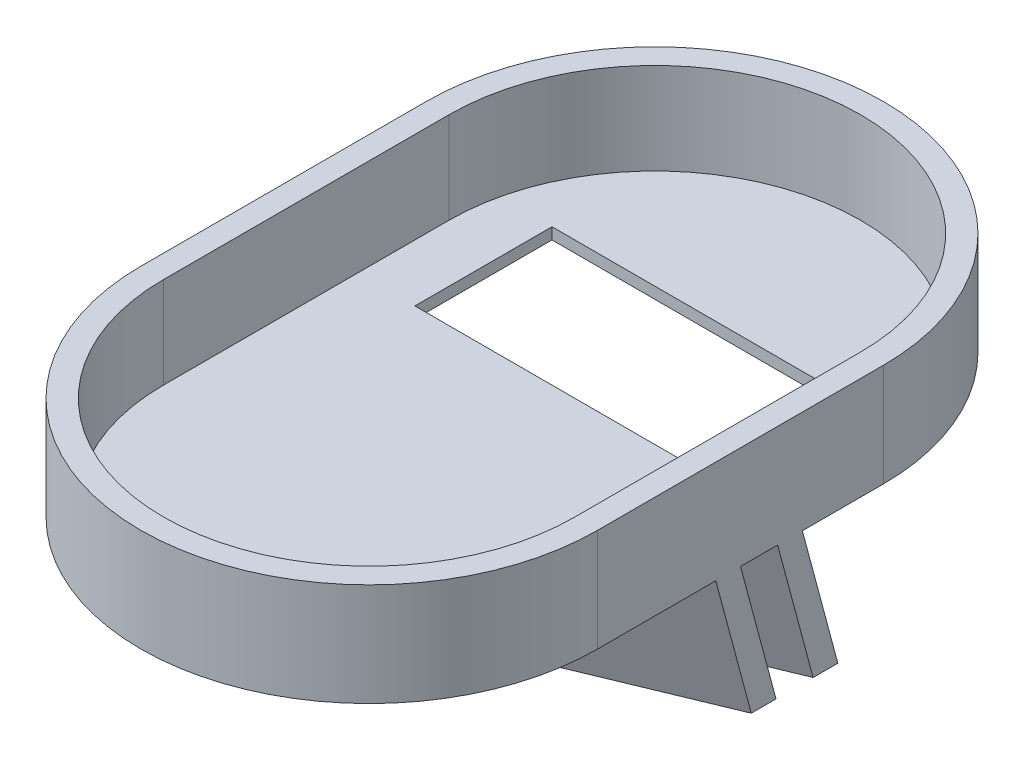
ISO-10303-21;
HEADER;
FILE_DESCRIPTION(('STEP AP214'),'2;1');
FILE_NAME('part.step','',(''),(''),'','','');
FILE_SCHEMA(('AUTOMOTIVE_DESIGN { 1 0 10303 214 1 1 1 1 }'));
ENDSEC;
DATA;
#1=APPLICATION_CONTEXT('core data for automotive mechanical design processes');
#2=APPLICATION_PROTOCOL_DEFINITION('international standard','automotive_design',2000,#1);
#3=PRODUCT_CONTEXT('',#1,'mechanical');
#4=PRODUCT('Part','Part','',(#3));
#5=PRODUCT_RELATED_PRODUCT_CATEGORY('part','',(#4));
#6=PRODUCT_DEFINITION_FORMATION('','',#4);
#7=PRODUCT_DEFINITION_CONTEXT('part definition',#1,'design');
#8=PRODUCT_DEFINITION('design','',#6,#7);
#9=PRODUCT_DEFINITION_SHAPE('','',#8);
#10=(LENGTH_UNIT() NAMED_UNIT(*) SI_UNIT(.MILLI.,.METRE.));
#11=(NAMED_UNIT(*) PLANE_ANGLE_UNIT() SI_UNIT($,.RADIAN.));
#12=(NAMED_UNIT(*) SI_UNIT($,.STERADIAN.) SOLID_ANGLE_UNIT());
#13=UNCERTAINTY_MEASURE_WITH_UNIT(LENGTH_MEASURE(1.E-05),#10,'distance_accuracy_value','');
#14=(GEOMETRIC_REPRESENTATION_CONTEXT(3) GLOBAL_UNCERTAINTY_ASSIGNED_CONTEXT((#13)) GLOBAL_UNIT_ASSIGNED_CONTEXT((#10,
#11,#12)) REPRESENTATION_CONTEXT('',''));
#15=CARTESIAN_POINT('',(0.,0.,0.));
#16=DIRECTION('',(0.,0.,1.));
#17=DIRECTION('',(1.,0.,0.));
#18=AXIS2_PLACEMENT_3D('',#15,#16,#17);
#19=CARTESIAN_POINT('',(0.,0.,12.5));
#20=DIRECTION('',(0.,1.,0.));
#21=DIRECTION('',(0.,0.,1.));
#22=AXIS2_PLACEMENT_3D('',#19,#20,#21);
#23=PLANE('',#22);
#24=DIRECTION('',(0.,0.,-1.));
#25=VECTOR('',#24,1.);
#26=CARTESIAN_POINT('',(13.,0.,-16.5));
#27=LINE('',#26,#25);
#28=CARTESIAN_POINT('',(13.,0.,-4.5));
#29=VERTEX_POINT('',#28);
#30=CARTESIAN_POINT('',(13.,0.,-16.5));
#31=VERTEX_POINT('',#30);
#32=EDGE_CURVE('E285',#29,#31,#27,.T.);
#33=ORIENTED_EDGE('',*,*,#32,.T.);
#34=DIRECTION('',(-1.,0.,0.));
#35=VECTOR('',#34,1.);
#36=CARTESIAN_POINT('',(-13.,0.,-16.5));
#37=LINE('',#36,#35);
#38=CARTESIAN_POINT('',(-13.,0.,-16.5));
#39=VERTEX_POINT('',#38);
#40=EDGE_CURVE('E299',#31,#39,#37,.T.);
#41=ORIENTED_EDGE('',*,*,#40,.T.);
#42=DIRECTION('',(0.,0.,1.));
#43=VECTOR('',#42,1.);
#44=CARTESIAN_POINT('',(-13.,0.,-16.5));
#45=LINE('',#44,#43);
#46=CARTESIAN_POINT('',(-13.,0.,-4.5));
#47=VERTEX_POINT('',#46);
#48=EDGE_CURVE('E302',#39,#47,#45,.T.);
#49=ORIENTED_EDGE('',*,*,#48,.T.);
#50=DIRECTION('',(1.,0.,0.));
#51=VECTOR('',#50,1.);
#52=CARTESIAN_POINT('',(-13.,0.,-4.5));
#53=LINE('',#52,#51);
#54=EDGE_CURVE('E289',#47,#29,#53,.T.);
#55=ORIENTED_EDGE('',*,*,#54,.T.);
#56=EDGE_LOOP('',(#33,#41,#49,#55));
#57=FACE_BOUND('',#56,.T.);
#58=DIRECTION('',(0.923879532511286,0.,-0.382683432365091));
#59=VECTOR('',#58,1.);
#60=CARTESIAN_POINT('',(0.,0.,2.87231024599995));
#61=LINE('',#60,#59);
#62=CARTESIAN_POINT('',(3.71470375165566,0.,1.33362957186595));
#63=VERTEX_POINT('',#62);
#64=CARTESIAN_POINT('',(20.,0.,-5.41196100146198));
#65=VERTEX_POINT('',#64);
#66=EDGE_CURVE('E249',#63,#65,#61,.T.);
#67=ORIENTED_EDGE('',*,*,#66,.F.);
#68=CARTESIAN_POINT('',(0.,0.,-8.27833836732432));
#69=DIRECTION('',(0.,1.,0.));
#70=DIRECTION('',(0.,0.,-1.));
#71=AXIS2_PLACEMENT_3D('',#68,#69,#70);
#72=ELLIPSE('',#71,10.3527618041008,10.);
#73=CARTESIAN_POINT('',(-3.71470375165565,0.,1.33362957186595));
#74=VERTEX_POINT('',#73);
#75=EDGE_CURVE('E331',#63,#74,#72,.F.);
#76=ORIENTED_EDGE('',*,*,#75,.T.);
#77=DIRECTION('',(0.923879532511286,0.,0.382683432365091));
#78=VECTOR('',#77,1.);
#79=CARTESIAN_POINT('',(-20.,0.,-5.41196100146197));
#80=LINE('',#79,#78);
#81=CARTESIAN_POINT('',(-20.,0.,-5.41196100146197));
#82=VERTEX_POINT('',#81);
#83=EDGE_CURVE('E383',#82,#74,#80,.T.);
#84=ORIENTED_EDGE('',*,*,#83,.F.);
#85=DIRECTION('',(0.,0.,1.));
#86=VECTOR('',#85,1.);
#87=CARTESIAN_POINT('',(-20.,0.,-12.5));
#88=LINE('',#87,#86);
#89=CARTESIAN_POINT('',(-20.,0.,-12.5));
#90=VERTEX_POINT('',#89);
#91=EDGE_CURVE('E267',#90,#82,#88,.T.);
#92=ORIENTED_EDGE('',*,*,#91,.F.);
#93=CARTESIAN_POINT('',(0.,0.,-12.5));
#94=DIRECTION('',(0.,1.,0.));
#95=DIRECTION('',(0.,0.,1.));
#96=AXIS2_PLACEMENT_3D('',#93,#94,#95);
#97=CIRCLE('',#96,20.);
#98=CARTESIAN_POINT('',(20.,0.,-12.5));
#99=VERTEX_POINT('',#98);
#100=EDGE_CURVE('E260',#99,#90,#97,.T.);
#101=ORIENTED_EDGE('',*,*,#100,.F.);
#102=DIRECTION('',(0.,0.,-1.));
#103=VECTOR('',#102,1.);
#104=CARTESIAN_POINT('',(20.,0.,12.5));
#105=LINE('',#104,#103);
#106=EDGE_CURVE('E258',#65,#99,#105,.T.);
#107=ORIENTED_EDGE('',*,*,#106,.F.);
#108=EDGE_LOOP('',(#67,#76,#84,#92,#101,#107));
#109=FACE_BOUND('',#108,.T.);
#110=ADVANCED_FACE('F43',(#57,#109),#23,.F.);
#111=DIRECTION('',(0.923879532511286,0.,-0.382683432365091));
#112=VECTOR('',#111,1.);
#113=CARTESIAN_POINT('',(0.,0.,8.28427124746192));
#114=LINE('',#113,#112);
#115=CARTESIAN_POINT('',(3.71470375165566,0.,6.74559057332792));
#116=VERTEX_POINT('',#115);
#117=CARTESIAN_POINT('',(20.,0.,0.));
#118=VERTEX_POINT('',#117);
#119=EDGE_CURVE('E378',#116,#118,#114,.T.);
#120=ORIENTED_EDGE('',*,*,#119,.F.);
#121=CARTESIAN_POINT('',(0.,0.,-2.86637736586235));
#122=DIRECTION('',(0.,1.,0.));
#123=DIRECTION('',(0.,0.,-1.));
#124=AXIS2_PLACEMENT_3D('',#121,#122,#123);
#125=ELLIPSE('',#124,10.3527618041008,10.);
#126=CARTESIAN_POINT('',(-3.71470375165566,0.,6.74559057332792));
#127=VERTEX_POINT('',#126);
#128=EDGE_CURVE('E345',#116,#127,#125,.F.);
#129=ORIENTED_EDGE('',*,*,#128,.T.);
#130=DIRECTION('',(0.923879532511286,0.,0.382683432365091));
#131=VECTOR('',#130,1.);
#132=CARTESIAN_POINT('',(-20.,0.,0.));
#133=LINE('',#132,#131);
#134=CARTESIAN_POINT('',(-20.,0.,0.));
#135=VERTEX_POINT('',#134);
#136=EDGE_CURVE('E376',#135,#127,#133,.T.);
#137=ORIENTED_EDGE('',*,*,#136,.F.);
#138=CARTESIAN_POINT('',(-20.,0.,-3.24717660087719));
#139=VERTEX_POINT('',#138);
#140=EDGE_CURVE('E271',#139,#135,#88,.T.);
#141=ORIENTED_EDGE('',*,*,#140,.F.);
#142=DIRECTION('',(-0.923879532511286,0.,-0.382683432365091));
#143=VECTOR('',#142,1.);
#144=CARTESIAN_POINT('',(-20.,0.,-3.24717660087719));
#145=LINE('',#144,#143);
#146=CARTESIAN_POINT('',(-3.71470375165566,0.,3.49841397245074));
#147=VERTEX_POINT('',#146);
#148=EDGE_CURVE('E250',#147,#139,#145,.T.);
#149=ORIENTED_EDGE('',*,*,#148,.F.);
#150=CARTESIAN_POINT('',(0.,0.,-6.11355396673953));
#151=DIRECTION('',(0.,1.,0.));
#152=DIRECTION('',(0.,0.,1.));
#153=AXIS2_PLACEMENT_3D('',#150,#151,#152);
#154=ELLIPSE('',#153,10.3527618041008,10.);
#155=CARTESIAN_POINT('',(3.71470375165566,0.,3.49841397245074));
#156=VERTEX_POINT('',#155);
#157=EDGE_CURVE('E248',#147,#156,#154,.T.);
#158=ORIENTED_EDGE('',*,*,#157,.T.);
#159=DIRECTION('',(-0.923879532511286,0.,0.382683432365091));
#160=VECTOR('',#159,1.);
#161=CARTESIAN_POINT('',(0.,0.,5.03709464658474));
#162=LINE('',#161,#160);
#163=CARTESIAN_POINT('',(20.,0.,-3.24717660087719));
#164=VERTEX_POINT('',#163);
#165=EDGE_CURVE('E231',#164,#156,#162,.T.);
#166=ORIENTED_EDGE('',*,*,#165,.F.);
#167=EDGE_CURVE('E245',#118,#164,#105,.T.);
#168=ORIENTED_EDGE('',*,*,#167,.F.);
#169=EDGE_LOOP('',(#120,#129,#137,#141,#149,#158,#166,#168));
#170=FACE_BOUND('',#169,.T.);
#171=ADVANCED_FACE('F244',(#170),#23,.F.);
#172=DIRECTION('',(-0.923879532511286,0.,-0.382683432365091));
#173=VECTOR('',#172,1.);
#174=CARTESIAN_POINT('',(-20.,0.,2.16478440058478));
#175=LINE('',#174,#173);
#176=CARTESIAN_POINT('',(-3.71470375165565,0.,8.91037497391271));
#177=VERTEX_POINT('',#176);
#178=CARTESIAN_POINT('',(-20.,0.,2.16478440058479));
#179=VERTEX_POINT('',#178);
#180=EDGE_CURVE('E394',#177,#179,#175,.T.);
#181=ORIENTED_EDGE('',*,*,#180,.F.);
#182=CARTESIAN_POINT('',(0.,0.,-0.701592965277559));
#183=DIRECTION('',(0.,1.,0.));
#184=DIRECTION('',(0.,0.,1.));
#185=AXIS2_PLACEMENT_3D('',#182,#183,#184);
#186=ELLIPSE('',#185,10.3527618041008,10.);
#187=CARTESIAN_POINT('',(3.71470375165567,0.,8.91037497391271));
#188=VERTEX_POINT('',#187);
#189=EDGE_CURVE('E11',#177,#188,#186,.T.);
#190=ORIENTED_EDGE('',*,*,#189,.T.);
#191=DIRECTION('',(-0.923879532511286,0.,0.382683432365091));
#192=VECTOR('',#191,1.);
#193=CARTESIAN_POINT('',(0.,0.,10.4490556480467));
#194=LINE('',#193,#192);
#195=CARTESIAN_POINT('',(20.,0.,2.16478440058478));
#196=VERTEX_POINT('',#195);
#197=EDGE_CURVE('E385',#196,#188,#194,.T.);
#198=ORIENTED_EDGE('',*,*,#197,.F.);
#199=CARTESIAN_POINT('',(20.,0.,12.5));
#200=VERTEX_POINT('',#199);
#201=EDGE_CURVE('E257',#200,#196,#105,.T.);
#202=ORIENTED_EDGE('',*,*,#201,.F.);
#203=CARTESIAN_POINT('',(0.,0.,12.5));
#204=DIRECTION('',(0.,1.,0.));
#205=DIRECTION('',(0.,0.,1.));
#206=AXIS2_PLACEMENT_3D('',#203,#204,#205);
#207=CIRCLE('',#206,20.);
#208=CARTESIAN_POINT('',(-20.,0.,12.5));
#209=VERTEX_POINT('',#208);
#210=EDGE_CURVE('E261',#209,#200,#207,.T.);
#211=ORIENTED_EDGE('',*,*,#210,.F.);
#212=EDGE_CURVE('E266',#179,#209,#88,.T.);
#213=ORIENTED_EDGE('',*,*,#212,.F.);
#214=EDGE_LOOP('',(#181,#190,#198,#202,#211,#213));
#215=FACE_BOUND('',#214,.T.);
#216=ADVANCED_FACE('F522',(#215),#23,.F.);
#217=CARTESIAN_POINT('',(0.,1.,12.5));
#218=DIRECTION('',(0.,1.,0.));
#219=DIRECTION('',(0.,0.,1.));
#220=AXIS2_PLACEMENT_3D('',#217,#218,#219);
#221=PLANE('',#220);
#222=CARTESIAN_POINT('',(0.,1.,12.5));
#223=DIRECTION('',(0.,1.,0.));
#224=DIRECTION('',(0.,0.,1.));
#225=AXIS2_PLACEMENT_3D('',#222,#223,#224);
#226=CIRCLE('',#225,18.);
#227=CARTESIAN_POINT('',(-18.,1.,12.5));
#228=VERTEX_POINT('',#227);
#229=CARTESIAN_POINT('',(18.,0.999999999999999,12.5));
#230=VERTEX_POINT('',#229);
#231=EDGE_CURVE('E316',#228,#230,#226,.T.);
#232=ORIENTED_EDGE('',*,*,#231,.T.);
#233=DIRECTION('',(0.,0.,-1.));
#234=VECTOR('',#233,1.);
#235=CARTESIAN_POINT('',(18.,1.,12.5));
#236=LINE('',#235,#234);
#237=CARTESIAN_POINT('',(18.,0.999999999999999,-12.5));
#238=VERTEX_POINT('',#237);
#239=EDGE_CURVE('E319',#230,#238,#236,.T.);
#240=ORIENTED_EDGE('',*,*,#239,.T.);
#241=CARTESIAN_POINT('',(0.,1.,-12.5));
#242=DIRECTION('',(0.,1.,0.));
#243=DIRECTION('',(0.,0.,1.));
#244=AXIS2_PLACEMENT_3D('',#241,#242,#243);
#245=CIRCLE('',#244,18.);
#246=CARTESIAN_POINT('',(-18.,0.999999999999999,-12.5));
#247=VERTEX_POINT('',#246);
#248=EDGE_CURVE('E322',#238,#247,#245,.T.);
#249=ORIENTED_EDGE('',*,*,#248,.T.);
#250=DIRECTION('',(0.,0.,1.));
#251=VECTOR('',#250,1.);
#252=CARTESIAN_POINT('',(-18.,1.,12.5));
#253=LINE('',#252,#251);
#254=EDGE_CURVE('E325',#247,#228,#253,.T.);
#255=ORIENTED_EDGE('',*,*,#254,.T.);
#256=EDGE_LOOP('',(#232,#240,#249,#255));
#257=FACE_BOUND('',#256,.T.);
#258=DIRECTION('',(-1.,0.,0.));
#259=VECTOR('',#258,1.);
#260=CARTESIAN_POINT('',(-13.,1.,-16.5));
#261=LINE('',#260,#259);
#262=CARTESIAN_POINT('',(13.,1.,-16.5));
#263=VERTEX_POINT('',#262);
#264=CARTESIAN_POINT('',(-13.,1.,-16.5));
#265=VERTEX_POINT('',#264);
#266=EDGE_CURVE('E288',#263,#265,#261,.T.);
#267=ORIENTED_EDGE('',*,*,#266,.F.);
#268=DIRECTION('',(0.,0.,-1.));
#269=VECTOR('',#268,1.);
#270=CARTESIAN_POINT('',(13.,1.,-16.5));
#271=LINE('',#270,#269);
#272=CARTESIAN_POINT('',(13.,1.,-4.5));
#273=VERTEX_POINT('',#272);
#274=EDGE_CURVE('E286',#273,#263,#271,.T.);
#275=ORIENTED_EDGE('',*,*,#274,.F.);
#276=DIRECTION('',(1.,0.,0.));
#277=VECTOR('',#276,1.);
#278=CARTESIAN_POINT('',(-13.,1.,-4.5));
#279=LINE('',#278,#277);
#280=CARTESIAN_POINT('',(-13.,1.,-4.5));
#281=VERTEX_POINT('',#280);
#282=EDGE_CURVE('E294',#281,#273,#279,.T.);
#283=ORIENTED_EDGE('',*,*,#282,.F.);
#284=DIRECTION('',(0.,0.,1.));
#285=VECTOR('',#284,1.);
#286=CARTESIAN_POINT('',(-13.,1.,-16.5));
#287=LINE('',#286,#285);
#288=EDGE_CURVE('E291',#265,#281,#287,.T.);
#289=ORIENTED_EDGE('',*,*,#288,.F.);
#290=EDGE_LOOP('',(#267,#275,#283,#289));
#291=FACE_BOUND('',#290,.T.);
#292=ADVANCED_FACE('F530',(#257,#291),#221,.T.);
#293=CARTESIAN_POINT('',(13.,1.,-16.5));
#294=DIRECTION('',(-1.,0.,0.));
#295=DIRECTION('',(0.,0.,1.));
#296=AXIS2_PLACEMENT_3D('',#293,#294,#295);
#297=PLANE('',#296);
#298=ORIENTED_EDGE('',*,*,#32,.F.);
#299=DIRECTION('',(0.,-1.,0.));
#300=VECTOR('',#299,1.);
#301=CARTESIAN_POINT('',(13.,1.,-4.5));
#302=LINE('',#301,#300);
#303=EDGE_CURVE('E296',#273,#29,#302,.T.);
#304=ORIENTED_EDGE('',*,*,#303,.F.);
#305=ORIENTED_EDGE('',*,*,#274,.T.);
#306=DIRECTION('',(0.,-1.,0.));
#307=VECTOR('',#306,1.);
#308=CARTESIAN_POINT('',(13.,1.,-16.5));
#309=LINE('',#308,#307);
#310=EDGE_CURVE('E313',#263,#31,#309,.T.);
#311=ORIENTED_EDGE('',*,*,#310,.T.);
#312=EDGE_LOOP('',(#298,#304,#305,#311));
#313=FACE_BOUND('',#312,.T.);
#314=ADVANCED_FACE('F535',(#313),#297,.T.);
#315=CARTESIAN_POINT('',(-13.,1.,-16.5));
#316=DIRECTION('',(0.,0.,1.));
#317=DIRECTION('',(1.,0.,0.));
#318=AXIS2_PLACEMENT_3D('',#315,#316,#317);
#319=PLANE('',#318);
#320=ORIENTED_EDGE('',*,*,#40,.F.);
#321=ORIENTED_EDGE('',*,*,#310,.F.);
#322=ORIENTED_EDGE('',*,*,#266,.T.);
#323=DIRECTION('',(0.,-1.,0.));
#324=VECTOR('',#323,1.);
#325=CARTESIAN_POINT('',(-13.,1.,-16.5));
#326=LINE('',#325,#324);
#327=EDGE_CURVE('E311',#265,#39,#326,.T.);
#328=ORIENTED_EDGE('',*,*,#327,.T.);
#329=EDGE_LOOP('',(#320,#321,#322,#328));
#330=FACE_BOUND('',#329,.T.);
#331=ADVANCED_FACE('F735',(#330),#319,.T.);
#332=CARTESIAN_POINT('',(-13.,1.,-16.5));
#333=DIRECTION('',(1.,0.,0.));
#334=DIRECTION('',(0.,0.,-1.));
#335=AXIS2_PLACEMENT_3D('',#332,#333,#334);
#336=PLANE('',#335);
#337=ORIENTED_EDGE('',*,*,#48,.F.);
#338=ORIENTED_EDGE('',*,*,#327,.F.);
#339=ORIENTED_EDGE('',*,*,#288,.T.);
#340=DIRECTION('',(0.,-1.,0.));
#341=VECTOR('',#340,1.);
#342=CARTESIAN_POINT('',(-13.,1.,-4.5));
#343=LINE('',#342,#341);
#344=EDGE_CURVE('E309',#281,#47,#343,.T.);
#345=ORIENTED_EDGE('',*,*,#344,.T.);
#346=EDGE_LOOP('',(#337,#338,#339,#345));
#347=FACE_BOUND('',#346,.T.);
#348=ADVANCED_FACE('F726',(#347),#336,.T.);
#349=CARTESIAN_POINT('',(-13.,1.,-4.5));
#350=DIRECTION('',(0.,0.,-1.));
#351=DIRECTION('',(-1.,0.,0.));
#352=AXIS2_PLACEMENT_3D('',#349,#350,#351);
#353=PLANE('',#352);
#354=ORIENTED_EDGE('',*,*,#54,.F.);
#355=ORIENTED_EDGE('',*,*,#344,.F.);
#356=ORIENTED_EDGE('',*,*,#282,.T.);
#357=ORIENTED_EDGE('',*,*,#303,.T.);
#358=EDGE_LOOP('',(#354,#355,#356,#357));
#359=FACE_BOUND('',#358,.T.);
#360=ADVANCED_FACE('F718',(#359),#353,.T.);
#361=CARTESIAN_POINT('',(0.,9.,12.5));
#362=DIRECTION('',(0.,1.,0.));
#363=DIRECTION('',(0.,0.,1.));
#364=AXIS2_PLACEMENT_3D('',#361,#362,#363);
#365=PLANE('',#364);
#366=CARTESIAN_POINT('',(0.,9.,12.5));
#367=DIRECTION('',(0.,1.,0.));
#368=DIRECTION('',(0.,0.,1.));
#369=AXIS2_PLACEMENT_3D('',#366,#367,#368);
#370=CIRCLE('',#369,20.);
#371=CARTESIAN_POINT('',(-20.,9.,12.5));
#372=VERTEX_POINT('',#371);
#373=CARTESIAN_POINT('',(20.,9.,12.5));
#374=VERTEX_POINT('',#373);
#375=EDGE_CURVE('E270',#372,#374,#370,.T.);
#376=ORIENTED_EDGE('',*,*,#375,.T.);
#377=DIRECTION('',(0.,0.,-1.));
#378=VECTOR('',#377,1.);
#379=CARTESIAN_POINT('',(20.,9.,12.5));
#380=LINE('',#379,#378);
#381=CARTESIAN_POINT('',(20.,9.,-12.5));
#382=VERTEX_POINT('',#381);
#383=EDGE_CURVE('E427',#374,#382,#380,.T.);
#384=ORIENTED_EDGE('',*,*,#383,.T.);
#385=CARTESIAN_POINT('',(0.,9.,-12.5));
#386=DIRECTION('',(0.,1.,0.));
#387=DIRECTION('',(0.,0.,1.));
#388=AXIS2_PLACEMENT_3D('',#385,#386,#387);
#389=CIRCLE('',#388,20.);
#390=CARTESIAN_POINT('',(-20.,9.,-12.5));
#391=VERTEX_POINT('',#390);
#392=EDGE_CURVE('E429',#382,#391,#389,.T.);
#393=ORIENTED_EDGE('',*,*,#392,.T.);
#394=DIRECTION('',(0.,0.,1.));
#395=VECTOR('',#394,1.);
#396=CARTESIAN_POINT('',(-20.,9.,-12.5));
#397=LINE('',#396,#395);
#398=EDGE_CURVE('E276',#391,#372,#397,.T.);
#399=ORIENTED_EDGE('',*,*,#398,.T.);
#400=EDGE_LOOP('',(#376,#384,#393,#399));
#401=FACE_BOUND('',#400,.T.);
#402=DIRECTION('',(0.,0.,-1.));
#403=VECTOR('',#402,1.);
#404=CARTESIAN_POINT('',(18.,9.,12.5));
#405=LINE('',#404,#403);
#406=CARTESIAN_POINT('',(18.,9.,12.5));
#407=VERTEX_POINT('',#406);
#408=CARTESIAN_POINT('',(18.,9.,-12.5));
#409=VERTEX_POINT('',#408);
#410=EDGE_CURVE('E407',#407,#409,#405,.T.);
#411=ORIENTED_EDGE('',*,*,#410,.F.);
#412=CARTESIAN_POINT('',(0.,9.,12.5));
#413=DIRECTION('',(0.,1.,0.));
#414=DIRECTION('',(0.,0.,1.));
#415=AXIS2_PLACEMENT_3D('',#412,#413,#414);
#416=CIRCLE('',#415,18.);
#417=CARTESIAN_POINT('',(-18.,9.,12.5));
#418=VERTEX_POINT('',#417);
#419=EDGE_CURVE('E405',#418,#407,#416,.T.);
#420=ORIENTED_EDGE('',*,*,#419,.F.);
#421=DIRECTION('',(0.,0.,1.));
#422=VECTOR('',#421,1.);
#423=CARTESIAN_POINT('',(-18.,9.,-12.5));
#424=LINE('',#423,#422);
#425=CARTESIAN_POINT('',(-18.,9.,-12.5));
#426=VERTEX_POINT('',#425);
#427=EDGE_CURVE('E412',#426,#418,#424,.T.);
#428=ORIENTED_EDGE('',*,*,#427,.F.);
#429=CARTESIAN_POINT('',(0.,9.,-12.5));
#430=DIRECTION('',(0.,1.,0.));
#431=DIRECTION('',(0.,0.,1.));
#432=AXIS2_PLACEMENT_3D('',#429,#430,#431);
#433=CIRCLE('',#432,18.);
#434=EDGE_CURVE('E409',#409,#426,#433,.T.);
#435=ORIENTED_EDGE('',*,*,#434,.F.);
#436=EDGE_LOOP('',(#411,#420,#428,#435));
#437=FACE_BOUND('',#436,.T.);
#438=ADVANCED_FACE('F433',(#401,#437),#365,.T.);
#439=CARTESIAN_POINT('',(0.,9.,12.5));
#440=DIRECTION('',(0.,-1.,0.));
#441=DIRECTION('',(0.,0.,-1.));
#442=AXIS2_PLACEMENT_3D('',#439,#440,#441);
#443=CYLINDRICAL_SURFACE('',#442,20.);
#444=ORIENTED_EDGE('',*,*,#210,.T.);
#445=DIRECTION('',(0.,-1.,0.));
#446=VECTOR('',#445,1.);
#447=CARTESIAN_POINT('',(20.,9.,12.5));
#448=LINE('',#447,#446);
#449=EDGE_CURVE('E282',#374,#200,#448,.T.);
#450=ORIENTED_EDGE('',*,*,#449,.F.);
#451=ORIENTED_EDGE('',*,*,#375,.F.);
#452=DIRECTION('',(0.,-1.,0.));
#453=VECTOR('',#452,1.);
#454=CARTESIAN_POINT('',(-20.,9.,12.5));
#455=LINE('',#454,#453);
#456=EDGE_CURVE('E272',#372,#209,#455,.T.);
#457=ORIENTED_EDGE('',*,*,#456,.T.);
#458=EDGE_LOOP('',(#444,#450,#451,#457));
#459=FACE_BOUND('',#458,.T.);
#460=ADVANCED_FACE('F445',(#459),#443,.T.);
#461=CARTESIAN_POINT('',(20.,9.,12.5));
#462=DIRECTION('',(-1.,0.,0.));
#463=DIRECTION('',(0.,0.,1.));
#464=AXIS2_PLACEMENT_3D('',#461,#462,#463);
#465=PLANE('',#464);
#466=ORIENTED_EDGE('',*,*,#201,.T.);
#467=DIRECTION('',(0.,0.965925826289067,0.258819045102525));
#468=VECTOR('',#467,1.);
#469=CARTESIAN_POINT('',(20.,-11.5911099154688,-0.941044140645515));
#470=LINE('',#469,#468);
#471=CARTESIAN_POINT('',(20.,-11.5911099154688,-0.941044140645515));
#472=VERTEX_POINT('',#471);
#473=EDGE_CURVE('E400',#472,#196,#470,.T.);
#474=ORIENTED_EDGE('',*,*,#473,.F.);
#475=DIRECTION('',(0.,0.,1.));
#476=VECTOR('',#475,1.);
#477=CARTESIAN_POINT('',(20.,-11.5911099154688,-3.1058285412303));
#478=LINE('',#477,#476);
#479=CARTESIAN_POINT('',(20.,-11.5911099154688,-3.1058285412303));
#480=VERTEX_POINT('',#479);
#481=EDGE_CURVE('E370',#480,#472,#478,.T.);
#482=ORIENTED_EDGE('',*,*,#481,.F.);
#483=DIRECTION('',(0.,0.965925826289067,0.258819045102525));
#484=VECTOR('',#483,1.);
#485=CARTESIAN_POINT('',(20.,-11.5911099154688,-3.1058285412303));
#486=LINE('',#485,#484);
#487=EDGE_CURVE('E256',#480,#118,#486,.T.);
#488=ORIENTED_EDGE('',*,*,#487,.T.);
#489=ORIENTED_EDGE('',*,*,#167,.T.);
#490=DIRECTION('',(0.,0.965925826289067,0.258819045102525));
#491=VECTOR('',#490,1.);
#492=CARTESIAN_POINT('',(20.,-11.5911099154688,-6.35300514210749));
#493=LINE('',#492,#491);
#494=CARTESIAN_POINT('',(20.,-11.5911099154688,-6.35300514210749));
#495=VERTEX_POINT('',#494);
#496=EDGE_CURVE('E228',#495,#164,#493,.T.);
#497=ORIENTED_EDGE('',*,*,#496,.F.);
#498=DIRECTION('',(0.,0.,1.));
#499=VECTOR('',#498,1.);
#500=CARTESIAN_POINT('',(20.,-11.5911099154688,-8.51778954269228));
#501=LINE('',#500,#499);
#502=CARTESIAN_POINT('',(20.,-11.5911099154688,-8.51778954269228));
#503=VERTEX_POINT('',#502);
#504=EDGE_CURVE('E476',#503,#495,#501,.T.);
#505=ORIENTED_EDGE('',*,*,#504,.F.);
#506=DIRECTION('',(0.,0.965925826289067,0.258819045102525));
#507=VECTOR('',#506,1.);
#508=CARTESIAN_POINT('',(20.,-11.5911099154688,-8.51778954269228));
#509=LINE('',#508,#507);
#510=EDGE_CURVE('E239',#503,#65,#509,.T.);
#511=ORIENTED_EDGE('',*,*,#510,.T.);
#512=ORIENTED_EDGE('',*,*,#106,.T.);
#513=DIRECTION('',(0.,-1.,0.));
#514=VECTOR('',#513,1.);
#515=CARTESIAN_POINT('',(20.,9.,-12.5));
#516=LINE('',#515,#514);
#517=EDGE_CURVE('E279',#382,#99,#516,.T.);
#518=ORIENTED_EDGE('',*,*,#517,.F.);
#519=ORIENTED_EDGE('',*,*,#383,.F.);
#520=ORIENTED_EDGE('',*,*,#449,.T.);
#521=EDGE_LOOP('',(#466,#474,#482,#488,#489,#497,#505,#511,#512,#518,#519,#520));
#522=FACE_BOUND('',#521,.T.);
#523=ADVANCED_FACE('F253',(#522),#465,.F.);
#524=CARTESIAN_POINT('',(0.,9.,-12.5));
#525=DIRECTION('',(0.,-1.,0.));
#526=DIRECTION('',(0.,0.,-1.));
#527=AXIS2_PLACEMENT_3D('',#524,#525,#526);
#528=CYLINDRICAL_SURFACE('',#527,20.);
#529=ORIENTED_EDGE('',*,*,#100,.T.);
#530=DIRECTION('',(0.,-1.,0.));
#531=VECTOR('',#530,1.);
#532=CARTESIAN_POINT('',(-20.,9.,-12.5));
#533=LINE('',#532,#531);
#534=EDGE_CURVE('E275',#391,#90,#533,.T.);
#535=ORIENTED_EDGE('',*,*,#534,.F.);
#536=ORIENTED_EDGE('',*,*,#392,.F.);
#537=ORIENTED_EDGE('',*,*,#517,.T.);
#538=EDGE_LOOP('',(#529,#535,#536,#537));
#539=FACE_BOUND('',#538,.T.);
#540=ADVANCED_FACE('F452',(#539),#528,.T.);
#541=CARTESIAN_POINT('',(-20.,9.,-12.5));
#542=DIRECTION('',(1.,0.,0.));
#543=DIRECTION('',(0.,0.,-1.));
#544=AXIS2_PLACEMENT_3D('',#541,#542,#543);
#545=PLANE('',#544);
#546=ORIENTED_EDGE('',*,*,#91,.T.);
#547=DIRECTION('',(0.,0.965925826289067,0.258819045102525));
#548=VECTOR('',#547,1.);
#549=CARTESIAN_POINT('',(-20.,-11.5911099154688,-8.51778954269227));
#550=LINE('',#549,#548);
#551=CARTESIAN_POINT('',(-20.,-11.5911099154688,-8.51778954269227));
#552=VERTEX_POINT('',#551);
#553=EDGE_CURVE('E462',#552,#82,#550,.T.);
#554=ORIENTED_EDGE('',*,*,#553,.F.);
#555=DIRECTION('',(0.,0.,-1.));
#556=VECTOR('',#555,1.);
#557=CARTESIAN_POINT('',(-20.,-11.5911099154688,-6.35300514210749));
#558=LINE('',#557,#556);
#559=CARTESIAN_POINT('',(-20.,-11.5911099154688,-6.35300514210749));
#560=VERTEX_POINT('',#559);
#561=EDGE_CURVE('E478',#560,#552,#558,.T.);
#562=ORIENTED_EDGE('',*,*,#561,.F.);
#563=DIRECTION('',(0.,0.965925826289067,0.258819045102525));
#564=VECTOR('',#563,1.);
#565=CARTESIAN_POINT('',(-20.,-11.5911099154688,-6.35300514210749));
#566=LINE('',#565,#564);
#567=EDGE_CURVE('E238',#560,#139,#566,.T.);
#568=ORIENTED_EDGE('',*,*,#567,.T.);
#569=ORIENTED_EDGE('',*,*,#140,.T.);
#570=DIRECTION('',(0.,0.965925826289067,0.258819045102525));
#571=VECTOR('',#570,1.);
#572=CARTESIAN_POINT('',(-20.,-11.5911099154688,-3.1058285412303));
#573=LINE('',#572,#571);
#574=CARTESIAN_POINT('',(-20.,-11.5911099154688,-3.1058285412303));
#575=VERTEX_POINT('',#574);
#576=EDGE_CURVE('E382',#575,#135,#573,.T.);
#577=ORIENTED_EDGE('',*,*,#576,.F.);
#578=DIRECTION('',(0.,0.,-1.));
#579=VECTOR('',#578,1.);
#580=CARTESIAN_POINT('',(-20.,-11.5911099154688,-0.941044140645514));
#581=LINE('',#580,#579);
#582=CARTESIAN_POINT('',(-20.,-11.5911099154688,-0.941044140645514));
#583=VERTEX_POINT('',#582);
#584=EDGE_CURVE('E396',#583,#575,#581,.T.);
#585=ORIENTED_EDGE('',*,*,#584,.F.);
#586=DIRECTION('',(0.,0.965925826289067,0.258819045102525));
#587=VECTOR('',#586,1.);
#588=CARTESIAN_POINT('',(-20.,-11.5911099154688,-0.941044140645514));
#589=LINE('',#588,#587);
#590=EDGE_CURVE('E397',#583,#179,#589,.T.);
#591=ORIENTED_EDGE('',*,*,#590,.T.);
#592=ORIENTED_EDGE('',*,*,#212,.T.);
#593=ORIENTED_EDGE('',*,*,#456,.F.);
#594=ORIENTED_EDGE('',*,*,#398,.F.);
#595=ORIENTED_EDGE('',*,*,#534,.T.);
#596=EDGE_LOOP('',(#546,#554,#562,#568,#569,#577,#585,#591,#592,#593,#594,#595));
#597=FACE_BOUND('',#596,.T.);
#598=ADVANCED_FACE('F440',(#597),#545,.F.);
#599=CARTESIAN_POINT('',(0.,9.,12.5));
#600=DIRECTION('',(0.,-1.,0.));
#601=DIRECTION('',(0.,0.,-1.));
#602=AXIS2_PLACEMENT_3D('',#599,#600,#601);
#603=CYLINDRICAL_SURFACE('',#602,18.);
#604=DIRECTION('',(0.,-1.,0.));
#605=VECTOR('',#604,1.);
#606=CARTESIAN_POINT('',(18.,9.,12.5));
#607=LINE('',#606,#605);
#608=EDGE_CURVE('E422',#407,#230,#607,.T.);
#609=ORIENTED_EDGE('',*,*,#608,.T.);
#610=ORIENTED_EDGE('',*,*,#231,.F.);
#611=DIRECTION('',(0.,-1.,0.));
#612=VECTOR('',#611,1.);
#613=CARTESIAN_POINT('',(-18.,9.,12.5));
#614=LINE('',#613,#612);
#615=EDGE_CURVE('E414',#418,#228,#614,.T.);
#616=ORIENTED_EDGE('',*,*,#615,.F.);
#617=ORIENTED_EDGE('',*,*,#419,.T.);
#618=EDGE_LOOP('',(#609,#610,#616,#617));
#619=FACE_BOUND('',#618,.T.);
#620=ADVANCED_FACE('F672',(#619),#603,.F.);
#621=CARTESIAN_POINT('',(18.,9.,12.5));
#622=DIRECTION('',(-1.,0.,0.));
#623=DIRECTION('',(0.,0.,1.));
#624=AXIS2_PLACEMENT_3D('',#621,#622,#623);
#625=PLANE('',#624);
#626=DIRECTION('',(0.,-1.,0.));
#627=VECTOR('',#626,1.);
#628=CARTESIAN_POINT('',(18.,9.,-12.5));
#629=LINE('',#628,#627);
#630=EDGE_CURVE('E419',#409,#238,#629,.T.);
#631=ORIENTED_EDGE('',*,*,#630,.T.);
#632=ORIENTED_EDGE('',*,*,#239,.F.);
#633=ORIENTED_EDGE('',*,*,#608,.F.);
#634=ORIENTED_EDGE('',*,*,#410,.T.);
#635=EDGE_LOOP('',(#631,#632,#633,#634));
#636=FACE_BOUND('',#635,.T.);
#637=ADVANCED_FACE('F663',(#636),#625,.T.);
#638=CARTESIAN_POINT('',(0.,9.,-12.5));
#639=DIRECTION('',(0.,-1.,0.));
#640=DIRECTION('',(0.,0.,-1.));
#641=AXIS2_PLACEMENT_3D('',#638,#639,#640);
#642=CYLINDRICAL_SURFACE('',#641,18.);
#643=DIRECTION('',(0.,-1.,0.));
#644=VECTOR('',#643,1.);
#645=CARTESIAN_POINT('',(-18.,9.,-12.5));
#646=LINE('',#645,#644);
#647=EDGE_CURVE('E416',#426,#247,#646,.T.);
#648=ORIENTED_EDGE('',*,*,#647,.T.);
#649=ORIENTED_EDGE('',*,*,#248,.F.);
#650=ORIENTED_EDGE('',*,*,#630,.F.);
#651=ORIENTED_EDGE('',*,*,#434,.T.);
#652=EDGE_LOOP('',(#648,#649,#650,#651));
#653=FACE_BOUND('',#652,.T.);
#654=ADVANCED_FACE('F654',(#653),#642,.F.);
#655=CARTESIAN_POINT('',(-18.,9.,-12.5));
#656=DIRECTION('',(1.,0.,0.));
#657=DIRECTION('',(0.,0.,-1.));
#658=AXIS2_PLACEMENT_3D('',#655,#656,#657);
#659=PLANE('',#658);
#660=ORIENTED_EDGE('',*,*,#615,.T.);
#661=ORIENTED_EDGE('',*,*,#254,.F.);
#662=ORIENTED_EDGE('',*,*,#647,.F.);
#663=ORIENTED_EDGE('',*,*,#427,.T.);
#664=EDGE_LOOP('',(#660,#661,#662,#663));
#665=FACE_BOUND('',#664,.T.);
#666=ADVANCED_FACE('F629',(#665),#659,.T.);
#667=CARTESIAN_POINT('',(-20.,-11.5911099154688,-3.1058285412303));
#668=DIRECTION('',(-0.371470375165566,-0.24029919847976,0.896808817744528));
#669=DIRECTION('',(0.923879532511286,0.,0.382683432365091));
#670=AXIS2_PLACEMENT_3D('',#667,#668,#669);
#671=PLANE('',#670);
#672=ORIENTED_EDGE('',*,*,#136,.T.);
#673=DIRECTION('',(0.,0.965925826289067,0.258819045102525));
#674=VECTOR('',#673,1.);
#675=CARTESIAN_POINT('',(-3.71470375165566,-11.2064397469353,3.74283409310852));
#676=LINE('',#675,#674);
#677=CARTESIAN_POINT('',(-3.71470375165566,-11.5911099154688,3.63976203209763));
#678=VERTEX_POINT('',#677);
#679=EDGE_CURVE('E347',#127,#678,#676,.F.);
#680=ORIENTED_EDGE('',*,*,#679,.T.);
#681=DIRECTION('',(0.923879532511286,0.,0.382683432365091));
#682=VECTOR('',#681,1.);
#683=CARTESIAN_POINT('',(-20.,-11.5911099154688,-3.1058285412303));
#684=LINE('',#683,#682);
#685=EDGE_CURVE('E364',#575,#678,#684,.T.);
#686=ORIENTED_EDGE('',*,*,#685,.F.);
#687=ORIENTED_EDGE('',*,*,#576,.T.);
#688=EDGE_LOOP('',(#672,#680,#686,#687));
#689=FACE_BOUND('',#688,.T.);
#690=ADVANCED_FACE('F380',(#689),#671,.F.);
#691=CARTESIAN_POINT('',(0.,-11.5911099154688,5.17844270623162));
#692=DIRECTION('',(0.371470375165566,-0.24029919847976,0.896808817744528));
#693=DIRECTION('',(0.923879532511286,0.,-0.382683432365091));
#694=AXIS2_PLACEMENT_3D('',#691,#692,#693);
#695=PLANE('',#694);
#696=DIRECTION('',(0.923879532511286,0.,-0.382683432365091));
#697=VECTOR('',#696,1.);
#698=CARTESIAN_POINT('',(0.,-11.5911099154688,5.17844270623162));
#699=LINE('',#698,#697);
#700=CARTESIAN_POINT('',(3.71470375165566,-11.5911099154688,3.63976203209762));
#701=VERTEX_POINT('',#700);
#702=EDGE_CURVE('E362',#701,#480,#699,.T.);
#703=ORIENTED_EDGE('',*,*,#702,.F.);
#704=DIRECTION('',(0.,0.965925826289067,0.258819045102525));
#705=VECTOR('',#704,1.);
#706=CARTESIAN_POINT('',(3.71470375165566,0.384670168533506,6.84866263433882));
#707=LINE('',#706,#705);
#708=EDGE_CURVE('E342',#701,#116,#707,.T.);
#709=ORIENTED_EDGE('',*,*,#708,.T.);
#710=ORIENTED_EDGE('',*,*,#119,.T.);
#711=ORIENTED_EDGE('',*,*,#487,.F.);
#712=EDGE_LOOP('',(#703,#709,#710,#711));
#713=FACE_BOUND('',#712,.T.);
#714=ADVANCED_FACE('F369',(#713),#695,.F.);
#715=CARTESIAN_POINT('',(0.,-11.5911099154688,7.34322710681641));
#716=DIRECTION('',(-0.371470375165566,0.24029919847976,-0.896808817744528));
#717=DIRECTION('',(-0.923879532511286,0.,0.382683432365091));
#718=AXIS2_PLACEMENT_3D('',#715,#716,#717);
#719=PLANE('',#718);
#720=ORIENTED_EDGE('',*,*,#197,.T.);
#721=DIRECTION('',(0.,0.965925826289067,0.258819045102525));
#722=VECTOR('',#721,1.);
#723=CARTESIAN_POINT('',(3.71470375165567,-11.2064397469353,5.90761849369331));
#724=LINE('',#723,#722);
#725=CARTESIAN_POINT('',(3.71470375165567,-11.5911099154688,5.80454643268241));
#726=VERTEX_POINT('',#725);
#727=EDGE_CURVE('E58',#188,#726,#724,.F.);
#728=ORIENTED_EDGE('',*,*,#727,.T.);
#729=DIRECTION('',(-0.923879532511286,0.,0.382683432365091));
#730=VECTOR('',#729,1.);
#731=CARTESIAN_POINT('',(0.,-11.5911099154688,7.34322710681641));
#732=LINE('',#731,#730);
#733=EDGE_CURVE('E486',#472,#726,#732,.T.);
#734=ORIENTED_EDGE('',*,*,#733,.F.);
#735=ORIENTED_EDGE('',*,*,#473,.T.);
#736=EDGE_LOOP('',(#720,#728,#734,#735));
#737=FACE_BOUND('',#736,.T.);
#738=ADVANCED_FACE('F537',(#737),#719,.F.);
#739=CARTESIAN_POINT('',(-20.,-11.5911099154688,-0.941044140645514));
#740=DIRECTION('',(0.371470375165566,0.24029919847976,-0.896808817744528));
#741=DIRECTION('',(-0.923879532511286,0.,-0.382683432365091));
#742=AXIS2_PLACEMENT_3D('',#739,#740,#741);
#743=PLANE('',#742);
#744=DIRECTION('',(-0.923879532511286,0.,-0.382683432365091));
#745=VECTOR('',#744,1.);
#746=CARTESIAN_POINT('',(-20.,-11.5911099154688,-0.941044140645514));
#747=LINE('',#746,#745);
#748=CARTESIAN_POINT('',(-3.71470375165565,-11.5911099154688,5.80454643268242));
#749=VERTEX_POINT('',#748);
#750=EDGE_CURVE('E390',#749,#583,#747,.T.);
#751=ORIENTED_EDGE('',*,*,#750,.F.);
#752=DIRECTION('',(0.,0.965925826289067,0.258819045102525));
#753=VECTOR('',#752,1.);
#754=CARTESIAN_POINT('',(-3.71470375165565,-13.2775075588008,5.35267754603385));
#755=LINE('',#754,#753);
#756=EDGE_CURVE('E349',#749,#177,#755,.T.);
#757=ORIENTED_EDGE('',*,*,#756,.T.);
#758=ORIENTED_EDGE('',*,*,#180,.T.);
#759=ORIENTED_EDGE('',*,*,#590,.F.);
#760=EDGE_LOOP('',(#751,#757,#758,#759));
#761=FACE_BOUND('',#760,.T.);
#762=ADVANCED_FACE('F493',(#761),#743,.F.);
#763=CARTESIAN_POINT('',(0.,-11.5911099154688,-3.1058285412303));
#764=DIRECTION('',(0.,-1.,0.));
#765=DIRECTION('',(0.,0.,-1.));
#766=AXIS2_PLACEMENT_3D('',#763,#764,#765);
#767=PLANE('',#766);
#768=ORIENTED_EDGE('',*,*,#733,.T.);
#769=CARTESIAN_POINT('',(0.,-11.5911099154688,-3.80742150650786));
#770=DIRECTION('',(0.,-1.,0.));
#771=DIRECTION('',(0.,0.,1.));
#772=AXIS2_PLACEMENT_3D('',#769,#770,#771);
#773=ELLIPSE('',#772,10.3527618041008,10.);
#774=EDGE_CURVE('E353',#726,#749,#773,.T.);
#775=ORIENTED_EDGE('',*,*,#774,.T.);
#776=ORIENTED_EDGE('',*,*,#750,.T.);
#777=ORIENTED_EDGE('',*,*,#584,.T.);
#778=ORIENTED_EDGE('',*,*,#685,.T.);
#779=CARTESIAN_POINT('',(0.,-11.5911099154688,-5.97220590709265));
#780=DIRECTION('',(0.,-1.,0.));
#781=DIRECTION('',(0.,0.,-1.));
#782=AXIS2_PLACEMENT_3D('',#779,#780,#781);
#783=ELLIPSE('',#782,10.3527618041008,10.);
#784=EDGE_CURVE('E51',#678,#701,#783,.F.);
#785=ORIENTED_EDGE('',*,*,#784,.T.);
#786=ORIENTED_EDGE('',*,*,#702,.T.);
#787=ORIENTED_EDGE('',*,*,#481,.T.);
#788=EDGE_LOOP('',(#768,#775,#776,#777,#778,#785,#786,#787));
#789=FACE_BOUND('',#788,.T.);
#790=ADVANCED_FACE('F361',(#789),#767,.T.);
#791=CARTESIAN_POINT('',(-20.,-11.5911099154688,-8.51778954269227));
#792=DIRECTION('',(-0.371470375165566,-0.24029919847976,0.896808817744528));
#793=DIRECTION('',(0.923879532511286,0.,0.382683432365091));
#794=AXIS2_PLACEMENT_3D('',#791,#792,#793);
#795=PLANE('',#794);
#796=ORIENTED_EDGE('',*,*,#83,.T.);
#797=DIRECTION('',(0.,0.965925826289067,0.258819045102525));
#798=VECTOR('',#797,1.);
#799=CARTESIAN_POINT('',(-3.71470375165565,-11.2064397469353,-1.66912690835345));
#800=LINE('',#799,#798);
#801=CARTESIAN_POINT('',(-3.71470375165565,-11.5911099154688,-1.77219896936435));
#802=VERTEX_POINT('',#801);
#803=EDGE_CURVE('E333',#74,#802,#800,.F.);
#804=ORIENTED_EDGE('',*,*,#803,.T.);
#805=DIRECTION('',(0.923879532511286,0.,0.382683432365091));
#806=VECTOR('',#805,1.);
#807=CARTESIAN_POINT('',(-20.,-11.5911099154688,-8.51778954269227));
#808=LINE('',#807,#806);
#809=EDGE_CURVE('E473',#552,#802,#808,.T.);
#810=ORIENTED_EDGE('',*,*,#809,.F.);
#811=ORIENTED_EDGE('',*,*,#553,.T.);
#812=EDGE_LOOP('',(#796,#804,#810,#811));
#813=FACE_BOUND('',#812,.T.);
#814=ADVANCED_FACE('F460',(#813),#795,.F.);
#815=CARTESIAN_POINT('',(0.,-11.5911099154688,-0.233518295230352));
#816=DIRECTION('',(0.371470375165566,-0.24029919847976,0.896808817744528));
#817=DIRECTION('',(0.923879532511286,0.,-0.382683432365091));
#818=AXIS2_PLACEMENT_3D('',#815,#816,#817);
#819=PLANE('',#818);
#820=DIRECTION('',(0.923879532511286,0.,-0.382683432365091));
#821=VECTOR('',#820,1.);
#822=CARTESIAN_POINT('',(0.,-11.5911099154688,-0.233518295230352));
#823=LINE('',#822,#821);
#824=CARTESIAN_POINT('',(3.71470375165566,-11.5911099154688,-1.77219896936435));
#825=VERTEX_POINT('',#824);
#826=EDGE_CURVE('E470',#825,#503,#823,.T.);
#827=ORIENTED_EDGE('',*,*,#826,.F.);
#828=DIRECTION('',(0.,0.965925826289067,0.258819045102525));
#829=VECTOR('',#828,1.);
#830=CARTESIAN_POINT('',(3.71470375165566,0.384670168533506,1.43670163287685));
#831=LINE('',#830,#829);
#832=EDGE_CURVE('E328',#825,#63,#831,.T.);
#833=ORIENTED_EDGE('',*,*,#832,.T.);
#834=ORIENTED_EDGE('',*,*,#66,.T.);
#835=ORIENTED_EDGE('',*,*,#510,.F.);
#836=EDGE_LOOP('',(#827,#833,#834,#835));
#837=FACE_BOUND('',#836,.T.);
#838=ADVANCED_FACE('F475',(#837),#819,.F.);
#839=CARTESIAN_POINT('',(0.,-11.5911099154688,1.93126610535444));
#840=DIRECTION('',(-0.371470375165566,0.24029919847976,-0.896808817744528));
#841=DIRECTION('',(-0.923879532511286,0.,0.382683432365091));
#842=AXIS2_PLACEMENT_3D('',#839,#840,#841);
#843=PLANE('',#842);
#844=ORIENTED_EDGE('',*,*,#165,.T.);
#845=DIRECTION('',(0.,0.965925826289067,0.258819045102525));
#846=VECTOR('',#845,1.);
#847=CARTESIAN_POINT('',(3.71470375165566,-11.2064397469353,0.495657492231339));
#848=LINE('',#847,#846);
#849=CARTESIAN_POINT('',(3.71470375165566,-11.5911099154688,0.392585431220442));
#850=VERTEX_POINT('',#849);
#851=EDGE_CURVE('E338',#156,#850,#848,.F.);
#852=ORIENTED_EDGE('',*,*,#851,.T.);
#853=DIRECTION('',(-0.923879532511286,0.,0.382683432365091));
#854=VECTOR('',#853,1.);
#855=CARTESIAN_POINT('',(0.,-11.5911099154688,1.93126610535444));
#856=LINE('',#855,#854);
#857=EDGE_CURVE('E234',#495,#850,#856,.T.);
#858=ORIENTED_EDGE('',*,*,#857,.F.);
#859=ORIENTED_EDGE('',*,*,#496,.T.);
#860=EDGE_LOOP('',(#844,#852,#858,#859));
#861=FACE_BOUND('',#860,.T.);
#862=ADVANCED_FACE('F230',(#861),#843,.F.);
#863=CARTESIAN_POINT('',(-20.,-11.5911099154688,-6.35300514210749));
#864=DIRECTION('',(0.371470375165566,0.24029919847976,-0.896808817744528));
#865=DIRECTION('',(-0.923879532511286,0.,-0.382683432365091));
#866=AXIS2_PLACEMENT_3D('',#863,#864,#865);
#867=PLANE('',#866);
#868=DIRECTION('',(-0.923879532511286,0.,-0.382683432365091));
#869=VECTOR('',#868,1.);
#870=CARTESIAN_POINT('',(-20.,-11.5911099154688,-6.35300514210749));
#871=LINE('',#870,#869);
#872=CARTESIAN_POINT('',(-3.71470375165566,-11.5911099154688,0.392585431220441));
#873=VERTEX_POINT('',#872);
#874=EDGE_CURVE('E502',#873,#560,#871,.T.);
#875=ORIENTED_EDGE('',*,*,#874,.F.);
#876=DIRECTION('',(0.,0.965925826289067,0.258819045102525));
#877=VECTOR('',#876,1.);
#878=CARTESIAN_POINT('',(-3.71470375165566,-13.2775075588008,-0.0592834554281269));
#879=LINE('',#878,#877);
#880=EDGE_CURVE('E335',#873,#147,#879,.T.);
#881=ORIENTED_EDGE('',*,*,#880,.T.);
#882=ORIENTED_EDGE('',*,*,#148,.T.);
#883=ORIENTED_EDGE('',*,*,#567,.F.);
#884=EDGE_LOOP('',(#875,#881,#882,#883));
#885=FACE_BOUND('',#884,.T.);
#886=ADVANCED_FACE('F508',(#885),#867,.F.);
#887=CARTESIAN_POINT('',(0.,-11.5911099154688,-3.1058285412303));
#888=DIRECTION('',(0.,-1.,0.));
#889=DIRECTION('',(0.,0.,-1.));
#890=AXIS2_PLACEMENT_3D('',#887,#888,#889);
#891=PLANE('',#890);
#892=ORIENTED_EDGE('',*,*,#857,.T.);
#893=CARTESIAN_POINT('',(0.,-11.5911099154688,-9.21938250796983));
#894=DIRECTION('',(0.,-1.,0.));
#895=DIRECTION('',(0.,0.,1.));
#896=AXIS2_PLACEMENT_3D('',#893,#894,#895);
#897=ELLIPSE('',#896,10.3527618041008,10.);
#898=EDGE_CURVE('E340',#850,#873,#897,.T.);
#899=ORIENTED_EDGE('',*,*,#898,.T.);
#900=ORIENTED_EDGE('',*,*,#874,.T.);
#901=ORIENTED_EDGE('',*,*,#561,.T.);
#902=ORIENTED_EDGE('',*,*,#809,.T.);
#903=CARTESIAN_POINT('',(0.,-11.5911099154688,-11.3841669085546));
#904=DIRECTION('',(0.,-1.,0.));
#905=DIRECTION('',(0.,0.,-1.));
#906=AXIS2_PLACEMENT_3D('',#903,#904,#905);
#907=ELLIPSE('',#906,10.3527618041008,10.);
#908=EDGE_CURVE('E355',#802,#825,#907,.F.);
#909=ORIENTED_EDGE('',*,*,#908,.T.);
#910=ORIENTED_EDGE('',*,*,#826,.T.);
#911=ORIENTED_EDGE('',*,*,#504,.T.);
#912=EDGE_LOOP('',(#892,#899,#900,#901,#902,#909,#910,#911));
#913=FACE_BOUND('',#912,.T.);
#914=ADVANCED_FACE('F469',(#913),#891,.T.);
#915=CARTESIAN_POINT('',(0.,-8.8034477621377,-10.6372150857987));
#916=DIRECTION('',(0.,-0.965925826289067,-0.258819045102525));
#917=DIRECTION('',(0.,0.258819045102525,-0.965925826289067));
#918=AXIS2_PLACEMENT_3D('',#915,#916,#917);
#919=CYLINDRICAL_SURFACE('',#918,10.);
#920=ORIENTED_EDGE('',*,*,#908,.F.);
#921=ORIENTED_EDGE('',*,*,#803,.F.);
#922=ORIENTED_EDGE('',*,*,#75,.F.);
#923=ORIENTED_EDGE('',*,*,#832,.F.);
#924=EDGE_LOOP('',(#920,#921,#922,#923));
#925=FACE_BOUND('',#924,.T.);
#926=ADVANCED_FACE('F465',(#925),#919,.F.);
#927=CARTESIAN_POINT('',(0.,-10.8745155740032,-9.02737163287341));
#928=DIRECTION('',(0.,0.965925826289067,0.258819045102525));
#929=DIRECTION('',(0.,-0.258819045102525,0.965925826289067));
#930=AXIS2_PLACEMENT_3D('',#927,#928,#929);
#931=CYLINDRICAL_SURFACE('',#930,10.);
#932=ORIENTED_EDGE('',*,*,#898,.F.);
#933=ORIENTED_EDGE('',*,*,#851,.F.);
#934=ORIENTED_EDGE('',*,*,#157,.F.);
#935=ORIENTED_EDGE('',*,*,#880,.F.);
#936=EDGE_LOOP('',(#932,#933,#934,#935));
#937=FACE_BOUND('',#936,.T.);
#938=ADVANCED_FACE('F507',(#937),#931,.T.);
#939=CARTESIAN_POINT('',(0.,-8.8034477621377,-5.22525408433676));
#940=DIRECTION('',(0.,-0.965925826289067,-0.258819045102525));
#941=DIRECTION('',(0.,0.258819045102525,-0.965925826289067));
#942=AXIS2_PLACEMENT_3D('',#939,#940,#941);
#943=CYLINDRICAL_SURFACE('',#942,10.);
#944=ORIENTED_EDGE('',*,*,#784,.F.);
#945=ORIENTED_EDGE('',*,*,#679,.F.);
#946=ORIENTED_EDGE('',*,*,#128,.F.);
#947=ORIENTED_EDGE('',*,*,#708,.F.);
#948=EDGE_LOOP('',(#944,#945,#946,#947));
#949=FACE_BOUND('',#948,.T.);
#950=ADVANCED_FACE('F372',(#949),#943,.F.);
#951=CARTESIAN_POINT('',(0.,-10.8745155740032,-3.61541063141144));
#952=DIRECTION('',(0.,0.965925826289067,0.258819045102525));
#953=DIRECTION('',(0.,-0.258819045102525,0.965925826289067));
#954=AXIS2_PLACEMENT_3D('',#951,#952,#953);
#955=CYLINDRICAL_SURFACE('',#954,10.);
#956=ORIENTED_EDGE('',*,*,#774,.F.);
#957=ORIENTED_EDGE('',*,*,#727,.F.);
#958=ORIENTED_EDGE('',*,*,#189,.F.);
#959=ORIENTED_EDGE('',*,*,#756,.F.);
#960=EDGE_LOOP('',(#956,#957,#958,#959));
#961=FACE_BOUND('',#960,.T.);
#962=ADVANCED_FACE('F45',(#961),#955,.T.);
#963=CLOSED_SHELL('',(#110,#171,#216,#292,#314,#331,#348,#360,#438,#460,#523,#540,#598,#620,
#637,#654,#666,#690,#714,#738,#762,#790,#814,#838,#862,#886,#914,#926,#938,#950,#962));
#964=MANIFOLD_SOLID_BREP('B2',#963);
#965=ADVANCED_BREP_SHAPE_REPRESENTATION('',(#18,#964),#14);
#966=SHAPE_DEFINITION_REPRESENTATION(#9,#965);
ENDSEC;
END-ISO-10303-21;
